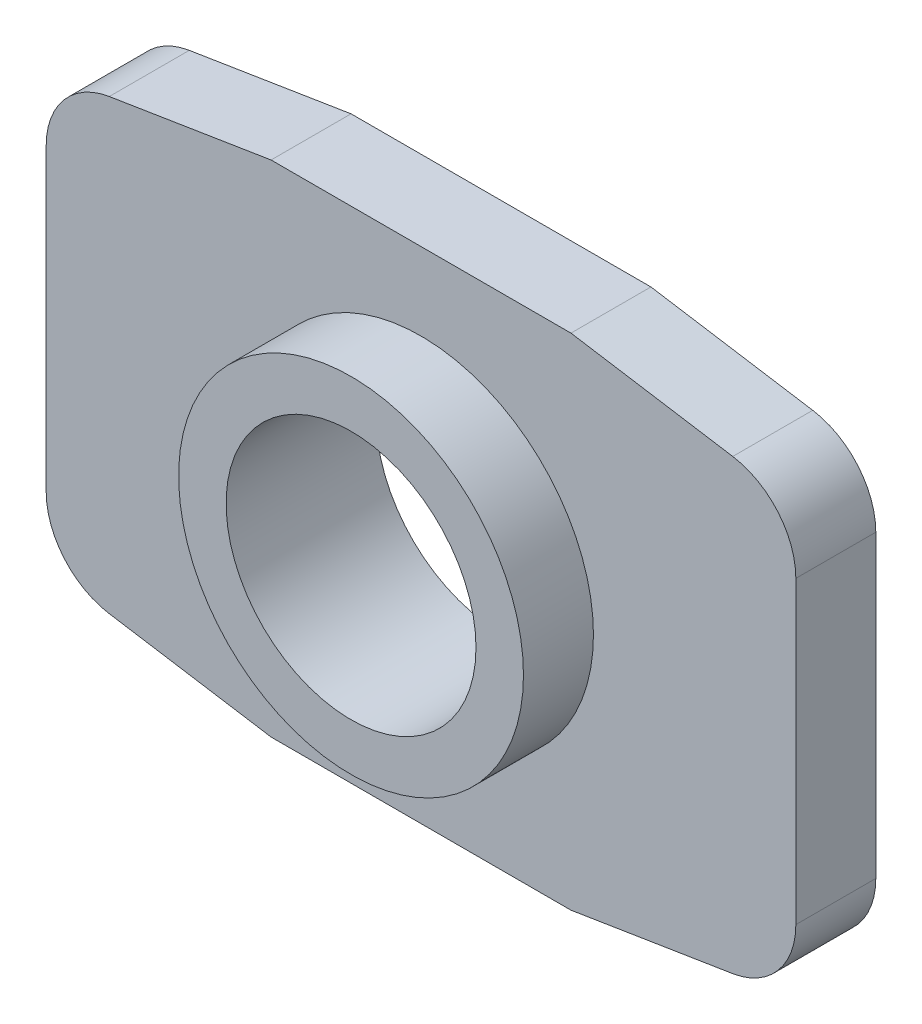
ISO-10303-21;
HEADER;
FILE_DESCRIPTION(('STEP AP214'),'2;1');
FILE_NAME('part.step','',(''),(''),'','','');
FILE_SCHEMA(('AUTOMOTIVE_DESIGN { 1 0 10303 214 1 1 1 1 }'));
ENDSEC;
DATA;
#1=APPLICATION_CONTEXT('core data for automotive mechanical design processes');
#2=APPLICATION_PROTOCOL_DEFINITION('international standard','automotive_design',2000,#1);
#3=PRODUCT_CONTEXT('',#1,'mechanical');
#4=PRODUCT('Part','Part','',(#3));
#5=PRODUCT_RELATED_PRODUCT_CATEGORY('part','',(#4));
#6=PRODUCT_DEFINITION_FORMATION('','',#4);
#7=PRODUCT_DEFINITION_CONTEXT('part definition',#1,'design');
#8=PRODUCT_DEFINITION('design','',#6,#7);
#9=PRODUCT_DEFINITION_SHAPE('','',#8);
#10=(LENGTH_UNIT() NAMED_UNIT(*) SI_UNIT(.MILLI.,.METRE.));
#11=(NAMED_UNIT(*) PLANE_ANGLE_UNIT() SI_UNIT($,.RADIAN.));
#12=(NAMED_UNIT(*) SI_UNIT($,.STERADIAN.) SOLID_ANGLE_UNIT());
#13=UNCERTAINTY_MEASURE_WITH_UNIT(LENGTH_MEASURE(1.E-05),#10,'distance_accuracy_value','');
#14=(GEOMETRIC_REPRESENTATION_CONTEXT(3) GLOBAL_UNCERTAINTY_ASSIGNED_CONTEXT((#13)) GLOBAL_UNIT_ASSIGNED_CONTEXT((#10,
#11,#12)) REPRESENTATION_CONTEXT('',''));
#15=CARTESIAN_POINT('',(0.,0.,0.));
#16=DIRECTION('',(0.,0.,1.));
#17=DIRECTION('',(1.,0.,0.));
#18=AXIS2_PLACEMENT_3D('',#15,#16,#17);
#19=CARTESIAN_POINT('',(6.,3.,1.6));
#20=DIRECTION('',(0.,0.,1.));
#21=DIRECTION('',(1.,0.,0.));
#22=AXIS2_PLACEMENT_3D('',#19,#20,#21);
#23=PLANE('',#22);
#24=CARTESIAN_POINT('',(6.,3.,1.6));
#25=DIRECTION('',(0.,0.,1.));
#26=DIRECTION('',(1.,0.,0.));
#27=AXIS2_PLACEMENT_3D('',#24,#25,#26);
#28=CIRCLE('',#27,1.5);
#29=CARTESIAN_POINT('',(7.5,3.,1.6));
#30=VERTEX_POINT('',#29);
#31=CARTESIAN_POINT('',(6.23739675280407,4.48109512920611,1.6));
#32=VERTEX_POINT('',#31);
#33=EDGE_CURVE('E181',#30,#32,#28,.T.);
#34=ORIENTED_EDGE('',*,*,#33,.T.);
#35=DIRECTION('',(-0.987396752804077,0.158264501869385,0.));
#36=VECTOR('',#35,1.);
#37=CARTESIAN_POINT('',(6.23739675280407,4.48109512920611,1.6));
#38=LINE('',#37,#36);
#39=CARTESIAN_POINT('',(3.,5.,1.6));
#40=VERTEX_POINT('',#39);
#41=EDGE_CURVE('E109',#32,#40,#38,.T.);
#42=ORIENTED_EDGE('',*,*,#41,.T.);
#43=DIRECTION('',(-1.,0.,0.));
#44=VECTOR('',#43,1.);
#45=CARTESIAN_POINT('',(-3.,5.,1.6));
#46=LINE('',#45,#44);
#47=CARTESIAN_POINT('',(-3.,5.,1.6));
#48=VERTEX_POINT('',#47);
#49=EDGE_CURVE('E208',#40,#48,#46,.T.);
#50=ORIENTED_EDGE('',*,*,#49,.T.);
#51=DIRECTION('',(-0.987396752804077,-0.158264501869386,0.));
#52=VECTOR('',#51,1.);
#53=CARTESIAN_POINT('',(-6.23739675280407,4.48109512920611,1.6));
#54=LINE('',#53,#52);
#55=CARTESIAN_POINT('',(-6.23739675280407,4.48109512920611,1.6));
#56=VERTEX_POINT('',#55);
#57=EDGE_CURVE('E226',#48,#56,#54,.T.);
#58=ORIENTED_EDGE('',*,*,#57,.T.);
#59=CARTESIAN_POINT('',(-6.,3.,1.6));
#60=DIRECTION('',(0.,0.,1.));
#61=DIRECTION('',(-1.,0.,0.));
#62=AXIS2_PLACEMENT_3D('',#59,#60,#61);
#63=CIRCLE('',#62,1.5);
#64=CARTESIAN_POINT('',(-7.5,3.,1.6));
#65=VERTEX_POINT('',#64);
#66=EDGE_CURVE('E223',#56,#65,#63,.T.);
#67=ORIENTED_EDGE('',*,*,#66,.T.);
#68=DIRECTION('',(0.,-1.,0.));
#69=VECTOR('',#68,1.);
#70=CARTESIAN_POINT('',(-7.5,-3.,1.6));
#71=LINE('',#70,#69);
#72=CARTESIAN_POINT('',(-7.5,-3.,1.6));
#73=VERTEX_POINT('',#72);
#74=EDGE_CURVE('E225',#65,#73,#71,.T.);
#75=ORIENTED_EDGE('',*,*,#74,.T.);
#76=CARTESIAN_POINT('',(-6.,-3.,1.6));
#77=DIRECTION('',(0.,0.,1.));
#78=DIRECTION('',(1.,0.,0.));
#79=AXIS2_PLACEMENT_3D('',#76,#77,#78);
#80=CIRCLE('',#79,1.5);
#81=CARTESIAN_POINT('',(-6.23739675280407,-4.48109512920612,1.6));
#82=VERTEX_POINT('',#81);
#83=EDGE_CURVE('E228',#73,#82,#80,.T.);
#84=ORIENTED_EDGE('',*,*,#83,.T.);
#85=DIRECTION('',(0.987396752804077,-0.158264501869385,0.));
#86=VECTOR('',#85,1.);
#87=CARTESIAN_POINT('',(-6.23739675280407,-4.48109512920612,1.6));
#88=LINE('',#87,#86);
#89=CARTESIAN_POINT('',(-3.,-5.,1.6));
#90=VERTEX_POINT('',#89);
#91=EDGE_CURVE('E234',#82,#90,#88,.T.);
#92=ORIENTED_EDGE('',*,*,#91,.T.);
#93=DIRECTION('',(1.,0.,0.));
#94=VECTOR('',#93,1.);
#95=CARTESIAN_POINT('',(-3.,-5.,1.6));
#96=LINE('',#95,#94);
#97=CARTESIAN_POINT('',(3.,-5.,1.6));
#98=VERTEX_POINT('',#97);
#99=EDGE_CURVE('E140',#90,#98,#96,.T.);
#100=ORIENTED_EDGE('',*,*,#99,.T.);
#101=DIRECTION('',(0.987396752804077,0.158264501869385,0.));
#102=VECTOR('',#101,1.);
#103=CARTESIAN_POINT('',(6.23739675280407,-4.48109512920611,1.6));
#104=LINE('',#103,#102);
#105=CARTESIAN_POINT('',(6.23739675280407,-4.48109512920612,1.6));
#106=VERTEX_POINT('',#105);
#107=EDGE_CURVE('E134',#98,#106,#104,.T.);
#108=ORIENTED_EDGE('',*,*,#107,.T.);
#109=CARTESIAN_POINT('',(6.,-3.,1.6));
#110=DIRECTION('',(0.,0.,1.));
#111=DIRECTION('',(-1.,0.,0.));
#112=AXIS2_PLACEMENT_3D('',#109,#110,#111);
#113=CIRCLE('',#112,1.5);
#114=CARTESIAN_POINT('',(7.5,-3.,1.6));
#115=VERTEX_POINT('',#114);
#116=EDGE_CURVE('E138',#106,#115,#113,.T.);
#117=ORIENTED_EDGE('',*,*,#116,.T.);
#118=DIRECTION('',(0.,1.,0.));
#119=VECTOR('',#118,1.);
#120=CARTESIAN_POINT('',(7.5,-3.,1.6));
#121=LINE('',#120,#119);
#122=EDGE_CURVE('E54',#115,#30,#121,.T.);
#123=ORIENTED_EDGE('',*,*,#122,.T.);
#124=EDGE_LOOP('',(#34,#42,#50,#58,#67,#75,#84,#92,#100,#108,#117,#123));
#125=FACE_BOUND('',#124,.T.);
#126=CARTESIAN_POINT('',(0.,0.,1.6));
#127=DIRECTION('',(0.,0.,1.));
#128=DIRECTION('',(1.,0.,0.));
#129=AXIS2_PLACEMENT_3D('',#126,#127,#128);
#130=CIRCLE('',#129,3.45);
#131=CARTESIAN_POINT('',(3.45,0.,1.6));
#132=VERTEX_POINT('',#131);
#133=EDGE_CURVE('E286',#132,#132,#130,.T.);
#134=ORIENTED_EDGE('',*,*,#133,.F.);
#135=EDGE_LOOP('',(#134));
#136=FACE_BOUND('',#135,.T.);
#137=ADVANCED_FACE('F37',(#125,#136),#23,.T.);
#138=CARTESIAN_POINT('',(6.,3.,1.6));
#139=DIRECTION('',(0.,0.,-1.));
#140=DIRECTION('',(-1.,0.,0.));
#141=AXIS2_PLACEMENT_3D('',#138,#139,#140);
#142=CYLINDRICAL_SURFACE('',#141,1.5);
#143=CARTESIAN_POINT('',(6.,3.,0.));
#144=DIRECTION('',(0.,0.,1.));
#145=DIRECTION('',(1.,0.,0.));
#146=AXIS2_PLACEMENT_3D('',#143,#144,#145);
#147=CIRCLE('',#146,1.5);
#148=CARTESIAN_POINT('',(7.5,3.,0.));
#149=VERTEX_POINT('',#148);
#150=CARTESIAN_POINT('',(6.23739675280407,4.48109512920611,0.));
#151=VERTEX_POINT('',#150);
#152=EDGE_CURVE('E158',#149,#151,#147,.T.);
#153=ORIENTED_EDGE('',*,*,#152,.T.);
#154=DIRECTION('',(0.,0.,-1.));
#155=VECTOR('',#154,1.);
#156=CARTESIAN_POINT('',(6.23739675280407,4.48109512920611,1.6));
#157=LINE('',#156,#155);
#158=EDGE_CURVE('E11',#32,#151,#157,.T.);
#159=ORIENTED_EDGE('',*,*,#158,.F.);
#160=ORIENTED_EDGE('',*,*,#33,.F.);
#161=DIRECTION('',(0.,0.,-1.));
#162=VECTOR('',#161,1.);
#163=CARTESIAN_POINT('',(7.5,3.,1.6));
#164=LINE('',#163,#162);
#165=EDGE_CURVE('E154',#30,#149,#164,.T.);
#166=ORIENTED_EDGE('',*,*,#165,.T.);
#167=EDGE_LOOP('',(#153,#159,#160,#166));
#168=FACE_BOUND('',#167,.T.);
#169=ADVANCED_FACE('F39',(#168),#142,.T.);
#170=CARTESIAN_POINT('',(6.23739675280407,4.48109512920611,1.6));
#171=DIRECTION('',(-0.158264501869385,-0.987396752804077,0.));
#172=DIRECTION('',(0.987396752804077,-0.158264501869385,0.));
#173=AXIS2_PLACEMENT_3D('',#170,#171,#172);
#174=PLANE('',#173);
#175=DIRECTION('',(-0.987396752804077,0.158264501869385,0.));
#176=VECTOR('',#175,1.);
#177=CARTESIAN_POINT('',(6.23739675280407,4.48109512920611,0.));
#178=LINE('',#177,#176);
#179=CARTESIAN_POINT('',(3.,5.,0.));
#180=VERTEX_POINT('',#179);
#181=EDGE_CURVE('E161',#151,#180,#178,.T.);
#182=ORIENTED_EDGE('',*,*,#181,.T.);
#183=DIRECTION('',(0.,0.,-1.));
#184=VECTOR('',#183,1.);
#185=CARTESIAN_POINT('',(3.,5.,1.6));
#186=LINE('',#185,#184);
#187=EDGE_CURVE('E46',#40,#180,#186,.T.);
#188=ORIENTED_EDGE('',*,*,#187,.F.);
#189=ORIENTED_EDGE('',*,*,#41,.F.);
#190=ORIENTED_EDGE('',*,*,#158,.T.);
#191=EDGE_LOOP('',(#182,#188,#189,#190));
#192=FACE_BOUND('',#191,.T.);
#193=ADVANCED_FACE('F264',(#192),#174,.F.);
#194=CARTESIAN_POINT('',(-3.,5.,1.6));
#195=DIRECTION('',(0.,-1.,0.));
#196=DIRECTION('',(0.,0.,-1.));
#197=AXIS2_PLACEMENT_3D('',#194,#195,#196);
#198=PLANE('',#197);
#199=DIRECTION('',(-1.,0.,0.));
#200=VECTOR('',#199,1.);
#201=CARTESIAN_POINT('',(-3.,5.,0.));
#202=LINE('',#201,#200);
#203=CARTESIAN_POINT('',(-3.,5.,0.));
#204=VERTEX_POINT('',#203);
#205=EDGE_CURVE('E164',#180,#204,#202,.T.);
#206=ORIENTED_EDGE('',*,*,#205,.T.);
#207=DIRECTION('',(0.,0.,-1.));
#208=VECTOR('',#207,1.);
#209=CARTESIAN_POINT('',(-3.,5.,1.6));
#210=LINE('',#209,#208);
#211=EDGE_CURVE('E200',#48,#204,#210,.T.);
#212=ORIENTED_EDGE('',*,*,#211,.F.);
#213=ORIENTED_EDGE('',*,*,#49,.F.);
#214=ORIENTED_EDGE('',*,*,#187,.T.);
#215=EDGE_LOOP('',(#206,#212,#213,#214));
#216=FACE_BOUND('',#215,.T.);
#217=ADVANCED_FACE('F206',(#216),#198,.F.);
#218=CARTESIAN_POINT('',(-6.23739675280407,4.48109512920611,1.6));
#219=DIRECTION('',(0.158264501869386,-0.987396752804077,0.));
#220=DIRECTION('',(0.987396752804077,0.158264501869386,0.));
#221=AXIS2_PLACEMENT_3D('',#218,#219,#220);
#222=PLANE('',#221);
#223=DIRECTION('',(-0.987396752804077,-0.158264501869386,0.));
#224=VECTOR('',#223,1.);
#225=CARTESIAN_POINT('',(-6.23739675280407,4.48109512920611,0.));
#226=LINE('',#225,#224);
#227=CARTESIAN_POINT('',(-6.23739675280407,4.48109512920611,0.));
#228=VERTEX_POINT('',#227);
#229=EDGE_CURVE('E166',#204,#228,#226,.T.);
#230=ORIENTED_EDGE('',*,*,#229,.T.);
#231=DIRECTION('',(0.,0.,-1.));
#232=VECTOR('',#231,1.);
#233=CARTESIAN_POINT('',(-6.23739675280407,4.48109512920611,1.6));
#234=LINE('',#233,#232);
#235=EDGE_CURVE('E197',#56,#228,#234,.T.);
#236=ORIENTED_EDGE('',*,*,#235,.F.);
#237=ORIENTED_EDGE('',*,*,#57,.F.);
#238=ORIENTED_EDGE('',*,*,#211,.T.);
#239=EDGE_LOOP('',(#230,#236,#237,#238));
#240=FACE_BOUND('',#239,.T.);
#241=ADVANCED_FACE('F217',(#240),#222,.F.);
#242=CARTESIAN_POINT('',(-6.,3.,1.6));
#243=DIRECTION('',(0.,0.,-1.));
#244=DIRECTION('',(-1.,0.,0.));
#245=AXIS2_PLACEMENT_3D('',#242,#243,#244);
#246=CYLINDRICAL_SURFACE('',#245,1.5);
#247=CARTESIAN_POINT('',(-6.,3.,0.));
#248=DIRECTION('',(0.,0.,1.));
#249=DIRECTION('',(-1.,0.,0.));
#250=AXIS2_PLACEMENT_3D('',#247,#248,#249);
#251=CIRCLE('',#250,1.5);
#252=CARTESIAN_POINT('',(-7.5,3.,0.));
#253=VERTEX_POINT('',#252);
#254=EDGE_CURVE('E168',#228,#253,#251,.T.);
#255=ORIENTED_EDGE('',*,*,#254,.T.);
#256=DIRECTION('',(0.,0.,-1.));
#257=VECTOR('',#256,1.);
#258=CARTESIAN_POINT('',(-7.5,3.,1.6));
#259=LINE('',#258,#257);
#260=EDGE_CURVE('E194',#65,#253,#259,.T.);
#261=ORIENTED_EDGE('',*,*,#260,.F.);
#262=ORIENTED_EDGE('',*,*,#66,.F.);
#263=ORIENTED_EDGE('',*,*,#235,.T.);
#264=EDGE_LOOP('',(#255,#261,#262,#263));
#265=FACE_BOUND('',#264,.T.);
#266=ADVANCED_FACE('F221',(#265),#246,.T.);
#267=CARTESIAN_POINT('',(-7.5,-3.,1.6));
#268=DIRECTION('',(1.,0.,0.));
#269=DIRECTION('',(0.,0.,-1.));
#270=AXIS2_PLACEMENT_3D('',#267,#268,#269);
#271=PLANE('',#270);
#272=DIRECTION('',(0.,-1.,0.));
#273=VECTOR('',#272,1.);
#274=CARTESIAN_POINT('',(-7.5,-3.,0.));
#275=LINE('',#274,#273);
#276=CARTESIAN_POINT('',(-7.5,-3.,0.));
#277=VERTEX_POINT('',#276);
#278=EDGE_CURVE('E170',#253,#277,#275,.T.);
#279=ORIENTED_EDGE('',*,*,#278,.T.);
#280=DIRECTION('',(0.,0.,-1.));
#281=VECTOR('',#280,1.);
#282=CARTESIAN_POINT('',(-7.5,-3.,1.6));
#283=LINE('',#282,#281);
#284=EDGE_CURVE('E191',#73,#277,#283,.T.);
#285=ORIENTED_EDGE('',*,*,#284,.F.);
#286=ORIENTED_EDGE('',*,*,#74,.F.);
#287=ORIENTED_EDGE('',*,*,#260,.T.);
#288=EDGE_LOOP('',(#279,#285,#286,#287));
#289=FACE_BOUND('',#288,.T.);
#290=ADVANCED_FACE('F366',(#289),#271,.F.);
#291=CARTESIAN_POINT('',(-6.,-3.,1.6));
#292=DIRECTION('',(0.,0.,-1.));
#293=DIRECTION('',(-1.,0.,0.));
#294=AXIS2_PLACEMENT_3D('',#291,#292,#293);
#295=CYLINDRICAL_SURFACE('',#294,1.5);
#296=CARTESIAN_POINT('',(-6.,-3.,0.));
#297=DIRECTION('',(0.,0.,1.));
#298=DIRECTION('',(1.,0.,0.));
#299=AXIS2_PLACEMENT_3D('',#296,#297,#298);
#300=CIRCLE('',#299,1.5);
#301=CARTESIAN_POINT('',(-6.23739675280407,-4.48109512920612,0.));
#302=VERTEX_POINT('',#301);
#303=EDGE_CURVE('E172',#277,#302,#300,.T.);
#304=ORIENTED_EDGE('',*,*,#303,.T.);
#305=DIRECTION('',(0.,0.,-1.));
#306=VECTOR('',#305,1.);
#307=CARTESIAN_POINT('',(-6.23739675280407,-4.48109512920612,1.6));
#308=LINE('',#307,#306);
#309=EDGE_CURVE('E188',#82,#302,#308,.T.);
#310=ORIENTED_EDGE('',*,*,#309,.F.);
#311=ORIENTED_EDGE('',*,*,#83,.F.);
#312=ORIENTED_EDGE('',*,*,#284,.T.);
#313=EDGE_LOOP('',(#304,#310,#311,#312));
#314=FACE_BOUND('',#313,.T.);
#315=ADVANCED_FACE('F357',(#314),#295,.T.);
#316=CARTESIAN_POINT('',(-6.23739675280407,-4.48109512920612,1.6));
#317=DIRECTION('',(0.158264501869385,0.987396752804077,0.));
#318=DIRECTION('',(-0.987396752804077,0.158264501869385,0.));
#319=AXIS2_PLACEMENT_3D('',#316,#317,#318);
#320=PLANE('',#319);
#321=DIRECTION('',(0.987396752804077,-0.158264501869385,0.));
#322=VECTOR('',#321,1.);
#323=CARTESIAN_POINT('',(-6.23739675280407,-4.48109512920612,0.));
#324=LINE('',#323,#322);
#325=CARTESIAN_POINT('',(-3.,-5.,0.));
#326=VERTEX_POINT('',#325);
#327=EDGE_CURVE('E174',#302,#326,#324,.T.);
#328=ORIENTED_EDGE('',*,*,#327,.T.);
#329=DIRECTION('',(0.,0.,-1.));
#330=VECTOR('',#329,1.);
#331=CARTESIAN_POINT('',(-3.,-5.,1.6));
#332=LINE('',#331,#330);
#333=EDGE_CURVE('E185',#90,#326,#332,.T.);
#334=ORIENTED_EDGE('',*,*,#333,.F.);
#335=ORIENTED_EDGE('',*,*,#91,.F.);
#336=ORIENTED_EDGE('',*,*,#309,.T.);
#337=EDGE_LOOP('',(#328,#334,#335,#336));
#338=FACE_BOUND('',#337,.T.);
#339=ADVANCED_FACE('F240',(#338),#320,.F.);
#340=CARTESIAN_POINT('',(-3.,-5.,1.6));
#341=DIRECTION('',(0.,1.,0.));
#342=DIRECTION('',(0.,0.,1.));
#343=AXIS2_PLACEMENT_3D('',#340,#341,#342);
#344=PLANE('',#343);
#345=DIRECTION('',(1.,0.,0.));
#346=VECTOR('',#345,1.);
#347=CARTESIAN_POINT('',(-3.,-5.,0.));
#348=LINE('',#347,#346);
#349=CARTESIAN_POINT('',(3.,-5.,0.));
#350=VERTEX_POINT('',#349);
#351=EDGE_CURVE('E176',#326,#350,#348,.T.);
#352=ORIENTED_EDGE('',*,*,#351,.T.);
#353=DIRECTION('',(0.,0.,-1.));
#354=VECTOR('',#353,1.);
#355=CARTESIAN_POINT('',(3.,-5.,1.6));
#356=LINE('',#355,#354);
#357=EDGE_CURVE('E149',#98,#350,#356,.T.);
#358=ORIENTED_EDGE('',*,*,#357,.F.);
#359=ORIENTED_EDGE('',*,*,#99,.F.);
#360=ORIENTED_EDGE('',*,*,#333,.T.);
#361=EDGE_LOOP('',(#352,#358,#359,#360));
#362=FACE_BOUND('',#361,.T.);
#363=ADVANCED_FACE('F244',(#362),#344,.F.);
#364=CARTESIAN_POINT('',(6.23739675280407,-4.48109512920611,1.6));
#365=DIRECTION('',(-0.158264501869385,0.987396752804077,0.));
#366=DIRECTION('',(-0.987396752804077,-0.158264501869385,0.));
#367=AXIS2_PLACEMENT_3D('',#364,#365,#366);
#368=PLANE('',#367);
#369=DIRECTION('',(0.987396752804077,0.158264501869385,0.));
#370=VECTOR('',#369,1.);
#371=CARTESIAN_POINT('',(6.23739675280407,-4.48109512920611,0.));
#372=LINE('',#371,#370);
#373=CARTESIAN_POINT('',(6.23739675280407,-4.48109512920612,0.));
#374=VERTEX_POINT('',#373);
#375=EDGE_CURVE('E148',#350,#374,#372,.T.);
#376=ORIENTED_EDGE('',*,*,#375,.T.);
#377=DIRECTION('',(0.,0.,-1.));
#378=VECTOR('',#377,1.);
#379=CARTESIAN_POINT('',(6.23739675280407,-4.48109512920612,1.6));
#380=LINE('',#379,#378);
#381=EDGE_CURVE('E145',#106,#374,#380,.T.);
#382=ORIENTED_EDGE('',*,*,#381,.F.);
#383=ORIENTED_EDGE('',*,*,#107,.F.);
#384=ORIENTED_EDGE('',*,*,#357,.T.);
#385=EDGE_LOOP('',(#376,#382,#383,#384));
#386=FACE_BOUND('',#385,.T.);
#387=ADVANCED_FACE('F146',(#386),#368,.F.);
#388=CARTESIAN_POINT('',(6.,-3.,1.6));
#389=DIRECTION('',(0.,0.,-1.));
#390=DIRECTION('',(-1.,0.,0.));
#391=AXIS2_PLACEMENT_3D('',#388,#389,#390);
#392=CYLINDRICAL_SURFACE('',#391,1.5);
#393=CARTESIAN_POINT('',(6.,-3.,0.));
#394=DIRECTION('',(0.,0.,1.));
#395=DIRECTION('',(-1.,0.,0.));
#396=AXIS2_PLACEMENT_3D('',#393,#394,#395);
#397=CIRCLE('',#396,1.5);
#398=CARTESIAN_POINT('',(7.5,-3.,0.));
#399=VERTEX_POINT('',#398);
#400=EDGE_CURVE('E95',#374,#399,#397,.T.);
#401=ORIENTED_EDGE('',*,*,#400,.T.);
#402=DIRECTION('',(0.,0.,-1.));
#403=VECTOR('',#402,1.);
#404=CARTESIAN_POINT('',(7.5,-3.,1.6));
#405=LINE('',#404,#403);
#406=EDGE_CURVE('E150',#115,#399,#405,.T.);
#407=ORIENTED_EDGE('',*,*,#406,.F.);
#408=ORIENTED_EDGE('',*,*,#116,.F.);
#409=ORIENTED_EDGE('',*,*,#381,.T.);
#410=EDGE_LOOP('',(#401,#407,#408,#409));
#411=FACE_BOUND('',#410,.T.);
#412=ADVANCED_FACE('F152',(#411),#392,.T.);
#413=CARTESIAN_POINT('',(7.5,-3.,1.6));
#414=DIRECTION('',(-1.,0.,0.));
#415=DIRECTION('',(0.,-1.,0.));
#416=AXIS2_PLACEMENT_3D('',#413,#414,#415);
#417=PLANE('',#416);
#418=DIRECTION('',(0.,1.,0.));
#419=VECTOR('',#418,1.);
#420=CARTESIAN_POINT('',(7.5,-3.,0.));
#421=LINE('',#420,#419);
#422=EDGE_CURVE('E101',#399,#149,#421,.T.);
#423=ORIENTED_EDGE('',*,*,#422,.T.);
#424=ORIENTED_EDGE('',*,*,#165,.F.);
#425=ORIENTED_EDGE('',*,*,#122,.F.);
#426=ORIENTED_EDGE('',*,*,#406,.T.);
#427=EDGE_LOOP('',(#423,#424,#425,#426));
#428=FACE_BOUND('',#427,.T.);
#429=ADVANCED_FACE('F248',(#428),#417,.F.);
#430=CARTESIAN_POINT('',(6.,3.,0.));
#431=DIRECTION('',(0.,0.,1.));
#432=DIRECTION('',(1.,0.,0.));
#433=AXIS2_PLACEMENT_3D('',#430,#431,#432);
#434=PLANE('',#433);
#435=CARTESIAN_POINT('',(0.,0.,0.));
#436=DIRECTION('',(0.,0.,1.));
#437=DIRECTION('',(1.,0.,0.));
#438=AXIS2_PLACEMENT_3D('',#435,#436,#437);
#439=CIRCLE('',#438,2.5);
#440=CARTESIAN_POINT('',(2.5,0.,0.));
#441=VERTEX_POINT('',#440);
#442=EDGE_CURVE('E281',#441,#441,#439,.T.);
#443=ORIENTED_EDGE('',*,*,#442,.T.);
#444=EDGE_LOOP('',(#443));
#445=FACE_BOUND('',#444,.T.);
#446=ORIENTED_EDGE('',*,*,#152,.F.);
#447=ORIENTED_EDGE('',*,*,#422,.F.);
#448=ORIENTED_EDGE('',*,*,#400,.F.);
#449=ORIENTED_EDGE('',*,*,#375,.F.);
#450=ORIENTED_EDGE('',*,*,#351,.F.);
#451=ORIENTED_EDGE('',*,*,#327,.F.);
#452=ORIENTED_EDGE('',*,*,#303,.F.);
#453=ORIENTED_EDGE('',*,*,#278,.F.);
#454=ORIENTED_EDGE('',*,*,#254,.F.);
#455=ORIENTED_EDGE('',*,*,#229,.F.);
#456=ORIENTED_EDGE('',*,*,#205,.F.);
#457=ORIENTED_EDGE('',*,*,#181,.F.);
#458=EDGE_LOOP('',(#446,#447,#448,#449,#450,#451,#452,#453,#454,#455,#456,#457));
#459=FACE_BOUND('',#458,.T.);
#460=ADVANCED_FACE('F212',(#445,#459),#434,.F.);
#461=CARTESIAN_POINT('',(0.,0.,3.));
#462=DIRECTION('',(0.,0.,-1.));
#463=DIRECTION('',(-1.,0.,0.));
#464=AXIS2_PLACEMENT_3D('',#461,#462,#463);
#465=CYLINDRICAL_SURFACE('',#464,3.45);
#466=CARTESIAN_POINT('',(0.,0.,3.));
#467=DIRECTION('',(0.,0.,1.));
#468=DIRECTION('',(1.,0.,0.));
#469=AXIS2_PLACEMENT_3D('',#466,#467,#468);
#470=CIRCLE('',#469,3.45);
#471=CARTESIAN_POINT('',(3.45,0.,3.));
#472=VERTEX_POINT('',#471);
#473=EDGE_CURVE('E162',#472,#472,#470,.T.);
#474=ORIENTED_EDGE('',*,*,#473,.F.);
#475=EDGE_LOOP('',(#474));
#476=FACE_BOUND('',#475,.T.);
#477=ORIENTED_EDGE('',*,*,#133,.T.);
#478=EDGE_LOOP('',(#477));
#479=FACE_BOUND('',#478,.T.);
#480=ADVANCED_FACE('F255',(#476,#479),#465,.T.);
#481=CARTESIAN_POINT('',(0.,0.,3.));
#482=DIRECTION('',(0.,0.,1.));
#483=DIRECTION('',(1.,0.,0.));
#484=AXIS2_PLACEMENT_3D('',#481,#482,#483);
#485=PLANE('',#484);
#486=CARTESIAN_POINT('',(0.,0.,3.));
#487=DIRECTION('',(0.,0.,1.));
#488=DIRECTION('',(1.,0.,0.));
#489=AXIS2_PLACEMENT_3D('',#486,#487,#488);
#490=CIRCLE('',#489,2.5);
#491=CARTESIAN_POINT('',(2.5,0.,3.));
#492=VERTEX_POINT('',#491);
#493=EDGE_CURVE('E284',#492,#492,#490,.T.);
#494=ORIENTED_EDGE('',*,*,#493,.F.);
#495=EDGE_LOOP('',(#494));
#496=FACE_BOUND('',#495,.T.);
#497=ORIENTED_EDGE('',*,*,#473,.T.);
#498=EDGE_LOOP('',(#497));
#499=FACE_BOUND('',#498,.T.);
#500=ADVANCED_FACE('F268',(#496,#499),#485,.T.);
#501=CARTESIAN_POINT('',(0.,0.,3.));
#502=DIRECTION('',(0.,0.,1.));
#503=DIRECTION('',(1.,0.,0.));
#504=AXIS2_PLACEMENT_3D('',#501,#502,#503);
#505=CYLINDRICAL_SURFACE('',#504,2.5);
#506=ORIENTED_EDGE('',*,*,#442,.F.);
#507=EDGE_LOOP('',(#506));
#508=FACE_BOUND('',#507,.T.);
#509=ORIENTED_EDGE('',*,*,#493,.T.);
#510=EDGE_LOOP('',(#509));
#511=FACE_BOUND('',#510,.T.);
#512=ADVANCED_FACE('F272',(#508,#511),#505,.F.);
#513=CLOSED_SHELL('',(#137,#169,#193,#217,#241,#266,#290,#315,#339,#363,#387,#412,#429,#460,
#480,#500,#512));
#514=MANIFOLD_SOLID_BREP('B2',#513);
#515=ADVANCED_BREP_SHAPE_REPRESENTATION('',(#18,#514),#14);
#516=SHAPE_DEFINITION_REPRESENTATION(#9,#515);
ENDSEC;
END-ISO-10303-21;
